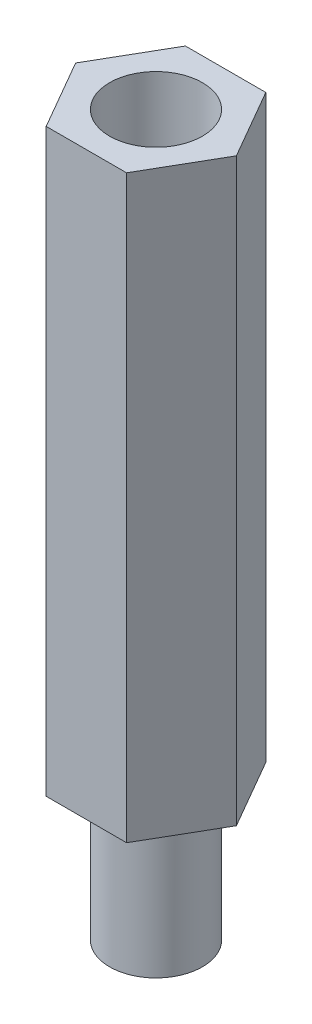
ISO-10303-21;
HEADER;
FILE_DESCRIPTION(('STEP AP214'),'2;1');
FILE_NAME('part.step','',(''),(''),'','','');
FILE_SCHEMA(('AUTOMOTIVE_DESIGN { 1 0 10303 214 1 1 1 1 }'));
ENDSEC;
DATA;
#1=APPLICATION_CONTEXT('core data for automotive mechanical design processes');
#2=APPLICATION_PROTOCOL_DEFINITION('international standard','automotive_design',2000,#1);
#3=PRODUCT_CONTEXT('',#1,'mechanical');
#4=PRODUCT('Part','Part','',(#3));
#5=PRODUCT_RELATED_PRODUCT_CATEGORY('part','',(#4));
#6=PRODUCT_DEFINITION_FORMATION('','',#4);
#7=PRODUCT_DEFINITION_CONTEXT('part definition',#1,'design');
#8=PRODUCT_DEFINITION('design','',#6,#7);
#9=PRODUCT_DEFINITION_SHAPE('','',#8);
#10=(LENGTH_UNIT() NAMED_UNIT(*) SI_UNIT(.MILLI.,.METRE.));
#11=(NAMED_UNIT(*) PLANE_ANGLE_UNIT() SI_UNIT($,.RADIAN.));
#12=(NAMED_UNIT(*) SI_UNIT($,.STERADIAN.) SOLID_ANGLE_UNIT());
#13=UNCERTAINTY_MEASURE_WITH_UNIT(LENGTH_MEASURE(1.E-05),#10,'distance_accuracy_value','');
#14=(GEOMETRIC_REPRESENTATION_CONTEXT(3) GLOBAL_UNCERTAINTY_ASSIGNED_CONTEXT((#13)) GLOBAL_UNIT_ASSIGNED_CONTEXT((#10,
#11,#12)) REPRESENTATION_CONTEXT('',''));
#15=CARTESIAN_POINT('',(0.,0.,0.));
#16=DIRECTION('',(0.,0.,1.));
#17=DIRECTION('',(1.,0.,0.));
#18=AXIS2_PLACEMENT_3D('',#15,#16,#17);
#19=CARTESIAN_POINT('',(0.,25.,0.));
#20=DIRECTION('',(0.,-1.,0.));
#21=DIRECTION('',(0.,0.,-1.));
#22=AXIS2_PLACEMENT_3D('',#19,#20,#21);
#23=CYLINDRICAL_SURFACE('',#22,2.);
#24=CARTESIAN_POINT('',(0.,25.,0.));
#25=DIRECTION('',(0.,1.,0.));
#26=DIRECTION('',(0.,0.,1.));
#27=AXIS2_PLACEMENT_3D('',#24,#25,#26);
#28=CIRCLE('',#27,2.);
#29=CARTESIAN_POINT('',(0.,25.,2.));
#30=VERTEX_POINT('',#29);
#31=EDGE_CURVE('E124',#30,#30,#28,.T.);
#32=ORIENTED_EDGE('',*,*,#31,.T.);
#33=EDGE_LOOP('',(#32));
#34=FACE_BOUND('',#33,.T.);
#35=CARTESIAN_POINT('',(0.,5.,0.));
#36=DIRECTION('',(0.,-1.,0.));
#37=DIRECTION('',(0.,0.,-1.));
#38=AXIS2_PLACEMENT_3D('',#35,#36,#37);
#39=CIRCLE('',#38,2.);
#40=CARTESIAN_POINT('',(0.,5.,-2.));
#41=VERTEX_POINT('',#40);
#42=EDGE_CURVE('E229',#41,#41,#39,.T.);
#43=ORIENTED_EDGE('',*,*,#42,.T.);
#44=EDGE_LOOP('',(#43));
#45=FACE_BOUND('',#44,.T.);
#46=ADVANCED_FACE('F34',(#34,#45),#23,.F.);
#47=CARTESIAN_POINT('',(0.,25.,0.));
#48=DIRECTION('',(0.,1.,0.));
#49=DIRECTION('',(0.,0.,1.));
#50=AXIS2_PLACEMENT_3D('',#47,#48,#49);
#51=PLANE('',#50);
#52=DIRECTION('',(0.499999999999995,0.,-0.866025403784442));
#53=VECTOR('',#52,1.);
#54=CARTESIAN_POINT('',(1.73205080756891,25.,2.99999999999997));
#55=LINE('',#54,#53);
#56=CARTESIAN_POINT('',(1.73205080756891,25.,2.99999999999997));
#57=VERTEX_POINT('',#56);
#58=CARTESIAN_POINT('',(3.46410161513774,25.,0.));
#59=VERTEX_POINT('',#58);
#60=EDGE_CURVE('E131',#57,#59,#55,.T.);
#61=ORIENTED_EDGE('',*,*,#60,.T.);
#62=DIRECTION('',(-0.500000000000001,0.,-0.866025403784438));
#63=VECTOR('',#62,1.);
#64=CARTESIAN_POINT('',(3.46410161513774,25.,0.));
#65=LINE('',#64,#63);
#66=CARTESIAN_POINT('',(1.73205080756886,25.,-2.99999999999999));
#67=VERTEX_POINT('',#66);
#68=EDGE_CURVE('E88',#59,#67,#65,.T.);
#69=ORIENTED_EDGE('',*,*,#68,.T.);
#70=DIRECTION('',(-1.,0.,0.));
#71=VECTOR('',#70,1.);
#72=CARTESIAN_POINT('',(1.73205080756886,25.,-2.99999999999999));
#73=LINE('',#72,#71);
#74=CARTESIAN_POINT('',(-1.73205080756889,25.,-2.99999999999998));
#75=VERTEX_POINT('',#74);
#76=EDGE_CURVE('E102',#67,#75,#73,.T.);
#77=ORIENTED_EDGE('',*,*,#76,.T.);
#78=DIRECTION('',(-0.499999999999995,0.,0.866025403784442));
#79=VECTOR('',#78,1.);
#80=CARTESIAN_POINT('',(-1.73205080756889,25.,-2.99999999999998));
#81=LINE('',#80,#79);
#82=CARTESIAN_POINT('',(-3.46410161513774,25.,0.));
#83=VERTEX_POINT('',#82);
#84=EDGE_CURVE('E95',#75,#83,#81,.T.);
#85=ORIENTED_EDGE('',*,*,#84,.T.);
#86=DIRECTION('',(0.500000000000007,0.,0.866025403784435));
#87=VECTOR('',#86,1.);
#88=CARTESIAN_POINT('',(-3.46410161513774,25.,0.));
#89=LINE('',#88,#87);
#90=CARTESIAN_POINT('',(-1.73205080756884,25.,3.00000000000001));
#91=VERTEX_POINT('',#90);
#92=EDGE_CURVE('E100',#83,#91,#89,.T.);
#93=ORIENTED_EDGE('',*,*,#92,.T.);
#94=DIRECTION('',(1.,0.,0.));
#95=VECTOR('',#94,1.);
#96=CARTESIAN_POINT('',(-1.73205080756884,25.,3.00000000000001));
#97=LINE('',#96,#95);
#98=EDGE_CURVE('E51',#91,#57,#97,.T.);
#99=ORIENTED_EDGE('',*,*,#98,.T.);
#100=EDGE_LOOP('',(#61,#69,#77,#85,#93,#99));
#101=FACE_BOUND('',#100,.T.);
#102=ORIENTED_EDGE('',*,*,#31,.F.);
#103=EDGE_LOOP('',(#102));
#104=FACE_BOUND('',#103,.T.);
#105=ADVANCED_FACE('F97',(#101,#104),#51,.T.);
#106=CARTESIAN_POINT('',(0.,0.,0.));
#107=DIRECTION('',(0.,1.,0.));
#108=DIRECTION('',(0.,0.,1.));
#109=AXIS2_PLACEMENT_3D('',#106,#107,#108);
#110=PLANE('',#109);
#111=DIRECTION('',(0.499999999999995,0.,-0.866025403784442));
#112=VECTOR('',#111,1.);
#113=CARTESIAN_POINT('',(1.73205080756891,0.,2.99999999999997));
#114=LINE('',#113,#112);
#115=CARTESIAN_POINT('',(1.73205080756891,0.,2.99999999999997));
#116=VERTEX_POINT('',#115);
#117=CARTESIAN_POINT('',(3.46410161513774,0.,0.));
#118=VERTEX_POINT('',#117);
#119=EDGE_CURVE('E120',#116,#118,#114,.T.);
#120=ORIENTED_EDGE('',*,*,#119,.F.);
#121=DIRECTION('',(1.,0.,0.));
#122=VECTOR('',#121,1.);
#123=CARTESIAN_POINT('',(-1.73205080756884,0.,3.00000000000001));
#124=LINE('',#123,#122);
#125=CARTESIAN_POINT('',(-1.73205080756884,0.,3.00000000000001));
#126=VERTEX_POINT('',#125);
#127=EDGE_CURVE('E80',#126,#116,#124,.T.);
#128=ORIENTED_EDGE('',*,*,#127,.F.);
#129=DIRECTION('',(0.500000000000007,0.,0.866025403784435));
#130=VECTOR('',#129,1.);
#131=CARTESIAN_POINT('',(-3.46410161513774,0.,0.));
#132=LINE('',#131,#130);
#133=CARTESIAN_POINT('',(-3.46410161513774,0.,0.));
#134=VERTEX_POINT('',#133);
#135=EDGE_CURVE('E74',#134,#126,#132,.T.);
#136=ORIENTED_EDGE('',*,*,#135,.F.);
#137=DIRECTION('',(-0.499999999999995,0.,0.866025403784442));
#138=VECTOR('',#137,1.);
#139=CARTESIAN_POINT('',(-1.73205080756889,0.,-2.99999999999998));
#140=LINE('',#139,#138);
#141=CARTESIAN_POINT('',(-1.73205080756889,0.,-2.99999999999998));
#142=VERTEX_POINT('',#141);
#143=EDGE_CURVE('E110',#142,#134,#140,.T.);
#144=ORIENTED_EDGE('',*,*,#143,.F.);
#145=DIRECTION('',(-1.,0.,0.));
#146=VECTOR('',#145,1.);
#147=CARTESIAN_POINT('',(1.73205080756886,0.,-2.99999999999999));
#148=LINE('',#147,#146);
#149=CARTESIAN_POINT('',(1.73205080756886,0.,-2.99999999999999));
#150=VERTEX_POINT('',#149);
#151=EDGE_CURVE('E126',#150,#142,#148,.T.);
#152=ORIENTED_EDGE('',*,*,#151,.F.);
#153=DIRECTION('',(-0.500000000000001,0.,-0.866025403784438));
#154=VECTOR('',#153,1.);
#155=CARTESIAN_POINT('',(3.46410161513774,0.,0.));
#156=LINE('',#155,#154);
#157=EDGE_CURVE('E123',#118,#150,#156,.T.);
#158=ORIENTED_EDGE('',*,*,#157,.F.);
#159=EDGE_LOOP('',(#120,#128,#136,#144,#152,#158));
#160=FACE_BOUND('',#159,.T.);
#161=CARTESIAN_POINT('',(0.,0.,0.));
#162=DIRECTION('',(0.,1.,0.));
#163=DIRECTION('',(0.,0.,1.));
#164=AXIS2_PLACEMENT_3D('',#161,#162,#163);
#165=CIRCLE('',#164,2.);
#166=CARTESIAN_POINT('',(0.,0.,2.));
#167=VERTEX_POINT('',#166);
#168=EDGE_CURVE('E232',#167,#167,#165,.T.);
#169=ORIENTED_EDGE('',*,*,#168,.T.);
#170=EDGE_LOOP('',(#169));
#171=FACE_BOUND('',#170,.T.);
#172=ADVANCED_FACE('F140',(#160,#171),#110,.F.);
#173=CARTESIAN_POINT('',(1.73205080756891,25.,2.99999999999997));
#174=DIRECTION('',(-0.866025403784442,0.,-0.499999999999995));
#175=DIRECTION('',(-0.499999999999995,0.,0.866025403784442));
#176=AXIS2_PLACEMENT_3D('',#173,#174,#175);
#177=PLANE('',#176);
#178=ORIENTED_EDGE('',*,*,#119,.T.);
#179=DIRECTION('',(0.,-1.,0.));
#180=VECTOR('',#179,1.);
#181=CARTESIAN_POINT('',(3.46410161513774,25.,0.));
#182=LINE('',#181,#180);
#183=EDGE_CURVE('E11',#59,#118,#182,.T.);
#184=ORIENTED_EDGE('',*,*,#183,.F.);
#185=ORIENTED_EDGE('',*,*,#60,.F.);
#186=DIRECTION('',(0.,-1.,0.));
#187=VECTOR('',#186,1.);
#188=CARTESIAN_POINT('',(1.73205080756891,25.,2.99999999999997));
#189=LINE('',#188,#187);
#190=EDGE_CURVE('E116',#57,#116,#189,.T.);
#191=ORIENTED_EDGE('',*,*,#190,.T.);
#192=EDGE_LOOP('',(#178,#184,#185,#191));
#193=FACE_BOUND('',#192,.T.);
#194=ADVANCED_FACE('F36',(#193),#177,.F.);
#195=CARTESIAN_POINT('',(3.46410161513774,25.,0.));
#196=DIRECTION('',(-0.866025403784438,0.,0.500000000000001));
#197=DIRECTION('',(0.500000000000001,0.,0.866025403784438));
#198=AXIS2_PLACEMENT_3D('',#195,#196,#197);
#199=PLANE('',#198);
#200=ORIENTED_EDGE('',*,*,#157,.T.);
#201=DIRECTION('',(0.,-1.,0.));
#202=VECTOR('',#201,1.);
#203=CARTESIAN_POINT('',(1.73205080756886,25.,-2.99999999999999));
#204=LINE('',#203,#202);
#205=EDGE_CURVE('E43',#67,#150,#204,.T.);
#206=ORIENTED_EDGE('',*,*,#205,.F.);
#207=ORIENTED_EDGE('',*,*,#68,.F.);
#208=ORIENTED_EDGE('',*,*,#183,.T.);
#209=EDGE_LOOP('',(#200,#206,#207,#208));
#210=FACE_BOUND('',#209,.T.);
#211=ADVANCED_FACE('F172',(#210),#199,.F.);
#212=CARTESIAN_POINT('',(1.73205080756886,25.,-2.99999999999999));
#213=DIRECTION('',(0.,0.,1.));
#214=DIRECTION('',(1.,0.,0.));
#215=AXIS2_PLACEMENT_3D('',#212,#213,#214);
#216=PLANE('',#215);
#217=ORIENTED_EDGE('',*,*,#151,.T.);
#218=DIRECTION('',(0.,-1.,0.));
#219=VECTOR('',#218,1.);
#220=CARTESIAN_POINT('',(-1.73205080756889,25.,-2.99999999999998));
#221=LINE('',#220,#219);
#222=EDGE_CURVE('E111',#75,#142,#221,.T.);
#223=ORIENTED_EDGE('',*,*,#222,.F.);
#224=ORIENTED_EDGE('',*,*,#76,.F.);
#225=ORIENTED_EDGE('',*,*,#205,.T.);
#226=EDGE_LOOP('',(#217,#223,#224,#225));
#227=FACE_BOUND('',#226,.T.);
#228=ADVANCED_FACE('F137',(#227),#216,.F.);
#229=CARTESIAN_POINT('',(-1.73205080756889,25.,-2.99999999999998));
#230=DIRECTION('',(0.866025403784442,0.,0.499999999999995));
#231=DIRECTION('',(0.499999999999995,0.,-0.866025403784442));
#232=AXIS2_PLACEMENT_3D('',#229,#230,#231);
#233=PLANE('',#232);
#234=ORIENTED_EDGE('',*,*,#143,.T.);
#235=DIRECTION('',(0.,-1.,0.));
#236=VECTOR('',#235,1.);
#237=CARTESIAN_POINT('',(-3.46410161513774,25.,0.));
#238=LINE('',#237,#236);
#239=EDGE_CURVE('E107',#83,#134,#238,.T.);
#240=ORIENTED_EDGE('',*,*,#239,.F.);
#241=ORIENTED_EDGE('',*,*,#84,.F.);
#242=ORIENTED_EDGE('',*,*,#222,.T.);
#243=EDGE_LOOP('',(#234,#240,#241,#242));
#244=FACE_BOUND('',#243,.T.);
#245=ADVANCED_FACE('F108',(#244),#233,.F.);
#246=CARTESIAN_POINT('',(-3.46410161513774,25.,0.));
#247=DIRECTION('',(0.866025403784435,0.,-0.500000000000007));
#248=DIRECTION('',(-0.500000000000007,0.,-0.866025403784435));
#249=AXIS2_PLACEMENT_3D('',#246,#247,#248);
#250=PLANE('',#249);
#251=ORIENTED_EDGE('',*,*,#135,.T.);
#252=DIRECTION('',(0.,-1.,0.));
#253=VECTOR('',#252,1.);
#254=CARTESIAN_POINT('',(-1.73205080756884,25.,3.00000000000001));
#255=LINE('',#254,#253);
#256=EDGE_CURVE('E112',#91,#126,#255,.T.);
#257=ORIENTED_EDGE('',*,*,#256,.F.);
#258=ORIENTED_EDGE('',*,*,#92,.F.);
#259=ORIENTED_EDGE('',*,*,#239,.T.);
#260=EDGE_LOOP('',(#251,#257,#258,#259));
#261=FACE_BOUND('',#260,.T.);
#262=ADVANCED_FACE('F114',(#261),#250,.F.);
#263=CARTESIAN_POINT('',(-1.73205080756884,25.,3.00000000000001));
#264=DIRECTION('',(0.,0.,-1.));
#265=DIRECTION('',(-1.,0.,0.));
#266=AXIS2_PLACEMENT_3D('',#263,#264,#265);
#267=PLANE('',#266);
#268=ORIENTED_EDGE('',*,*,#127,.T.);
#269=ORIENTED_EDGE('',*,*,#190,.F.);
#270=ORIENTED_EDGE('',*,*,#98,.F.);
#271=ORIENTED_EDGE('',*,*,#256,.T.);
#272=EDGE_LOOP('',(#268,#269,#270,#271));
#273=FACE_BOUND('',#272,.T.);
#274=ADVANCED_FACE('F145',(#273),#267,.F.);
#275=CARTESIAN_POINT('',(0.,5.,0.));
#276=DIRECTION('',(0.,-1.,0.));
#277=DIRECTION('',(0.,0.,-1.));
#278=AXIS2_PLACEMENT_3D('',#275,#276,#277);
#279=PLANE('',#278);
#280=ORIENTED_EDGE('',*,*,#42,.F.);
#281=EDGE_LOOP('',(#280));
#282=FACE_BOUND('',#281,.T.);
#283=ADVANCED_FACE('F147',(#282),#279,.F.);
#284=CARTESIAN_POINT('',(0.,5.,0.));
#285=DIRECTION('',(0.,-1.,0.));
#286=DIRECTION('',(0.,0.,-1.));
#287=AXIS2_PLACEMENT_3D('',#284,#285,#286);
#288=CYLINDRICAL_SURFACE('',#287,2.);
#289=CARTESIAN_POINT('',(0.,-6.,0.));
#290=DIRECTION('',(0.,-1.,0.));
#291=DIRECTION('',(0.,0.,-1.));
#292=AXIS2_PLACEMENT_3D('',#289,#290,#291);
#293=CIRCLE('',#292,2.);
#294=CARTESIAN_POINT('',(0.,-6.,-2.));
#295=VERTEX_POINT('',#294);
#296=EDGE_CURVE('E228',#295,#295,#293,.T.);
#297=ORIENTED_EDGE('',*,*,#296,.F.);
#298=EDGE_LOOP('',(#297));
#299=FACE_BOUND('',#298,.T.);
#300=ORIENTED_EDGE('',*,*,#168,.F.);
#301=EDGE_LOOP('',(#300));
#302=FACE_BOUND('',#301,.T.);
#303=ADVANCED_FACE('F153',(#299,#302),#288,.T.);
#304=CARTESIAN_POINT('',(0.,-6.,0.));
#305=DIRECTION('',(0.,-1.,0.));
#306=DIRECTION('',(0.,0.,-1.));
#307=AXIS2_PLACEMENT_3D('',#304,#305,#306);
#308=PLANE('',#307);
#309=ORIENTED_EDGE('',*,*,#296,.T.);
#310=EDGE_LOOP('',(#309));
#311=FACE_BOUND('',#310,.T.);
#312=ADVANCED_FACE('F213',(#311),#308,.T.);
#313=CLOSED_SHELL('',(#46,#105,#172,#194,#211,#228,#245,#262,#274,#283,#303,#312));
#314=MANIFOLD_SOLID_BREP('B2',#313);
#315=ADVANCED_BREP_SHAPE_REPRESENTATION('',(#18,#314),#14);
#316=SHAPE_DEFINITION_REPRESENTATION(#9,#315);
ENDSEC;
END-ISO-10303-21;
